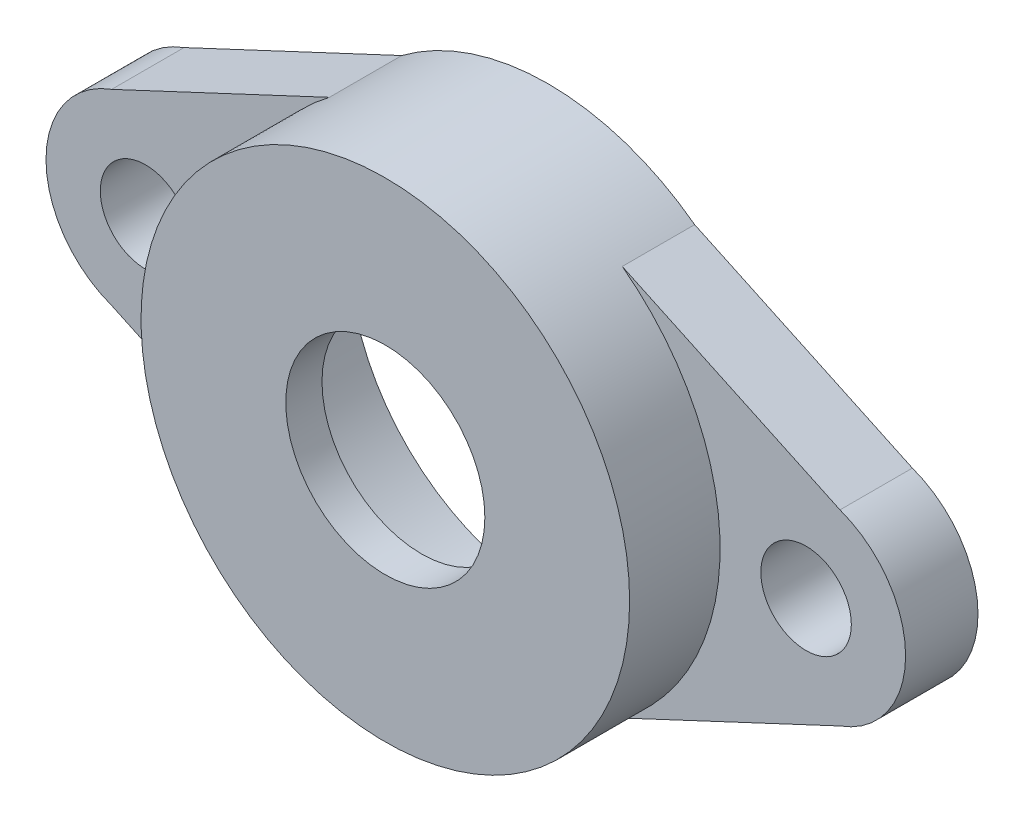
ISO-10303-21;
HEADER;
FILE_DESCRIPTION(('STEP AP214'),'2;1');
FILE_NAME('part.step','',(''),(''),'','','');
FILE_SCHEMA(('AUTOMOTIVE_DESIGN { 1 0 10303 214 1 1 1 1 }'));
ENDSEC;
DATA;
#1=APPLICATION_CONTEXT('core data for automotive mechanical design processes');
#2=APPLICATION_PROTOCOL_DEFINITION('international standard','automotive_design',2000,#1);
#3=PRODUCT_CONTEXT('',#1,'mechanical');
#4=PRODUCT('Part','Part','',(#3));
#5=PRODUCT_RELATED_PRODUCT_CATEGORY('part','',(#4));
#6=PRODUCT_DEFINITION_FORMATION('','',#4);
#7=PRODUCT_DEFINITION_CONTEXT('part definition',#1,'design');
#8=PRODUCT_DEFINITION('design','',#6,#7);
#9=PRODUCT_DEFINITION_SHAPE('','',#8);
#10=(LENGTH_UNIT() NAMED_UNIT(*) SI_UNIT(.MILLI.,.METRE.));
#11=(NAMED_UNIT(*) PLANE_ANGLE_UNIT() SI_UNIT($,.RADIAN.));
#12=(NAMED_UNIT(*) SI_UNIT($,.STERADIAN.) SOLID_ANGLE_UNIT());
#13=UNCERTAINTY_MEASURE_WITH_UNIT(LENGTH_MEASURE(1.E-05),#10,'distance_accuracy_value','');
#14=(GEOMETRIC_REPRESENTATION_CONTEXT(3) GLOBAL_UNCERTAINTY_ASSIGNED_CONTEXT((#13)) GLOBAL_UNIT_ASSIGNED_CONTEXT((#10,
#11,#12)) REPRESENTATION_CONTEXT('',''));
#15=CARTESIAN_POINT('',(0.,0.,0.));
#16=DIRECTION('',(0.,0.,1.));
#17=DIRECTION('',(1.,0.,0.));
#18=AXIS2_PLACEMENT_3D('',#15,#16,#17);
#19=CARTESIAN_POINT('',(0.,0.,4.));
#20=DIRECTION('',(0.,0.,1.));
#21=DIRECTION('',(1.,0.,0.));
#22=AXIS2_PLACEMENT_3D('',#19,#20,#21);
#23=PLANE('',#22);
#24=CARTESIAN_POINT('',(0.,0.,4.));
#25=DIRECTION('',(0.,0.,1.));
#26=DIRECTION('',(1.,0.,0.));
#27=AXIS2_PLACEMENT_3D('',#24,#25,#26);
#28=CIRCLE('',#27,13.5);
#29=CARTESIAN_POINT('',(-8.09371855645499,-10.8047082296976,4.));
#30=VERTEX_POINT('',#29);
#31=CARTESIAN_POINT('',(-8.09371855645499,10.8047082296976,4.));
#32=VERTEX_POINT('',#31);
#33=EDGE_CURVE('E96',#30,#32,#28,.F.);
#34=ORIENTED_EDGE('',*,*,#33,.T.);
#35=DIRECTION('',(-0.905614457047398,-0.424101939616817,0.));
#36=VECTOR('',#35,1.);
#37=CARTESIAN_POINT('',(-20.1239972704098,5.17089298192262,4.));
#38=LINE('',#37,#36);
#39=CARTESIAN_POINT('',(-20.1239972704098,5.17089298192262,4.));
#40=VERTEX_POINT('',#39);
#41=EDGE_CURVE('E148',#32,#40,#38,.T.);
#42=ORIENTED_EDGE('',*,*,#41,.T.);
#43=CARTESIAN_POINT('',(-18.25,0.,4.));
#44=DIRECTION('',(0.,0.,1.));
#45=DIRECTION('',(1.,0.,0.));
#46=AXIS2_PLACEMENT_3D('',#43,#44,#45);
#47=CIRCLE('',#46,5.5);
#48=CARTESIAN_POINT('',(-20.1239972704098,-5.17089298192262,4.));
#49=VERTEX_POINT('',#48);
#50=EDGE_CURVE('E165',#40,#49,#47,.T.);
#51=ORIENTED_EDGE('',*,*,#50,.T.);
#52=DIRECTION('',(0.905614457047398,-0.424101939616817,0.));
#53=VECTOR('',#52,1.);
#54=CARTESIAN_POINT('',(-20.1239972704098,-5.17089298192262,4.));
#55=LINE('',#54,#53);
#56=EDGE_CURVE('E118',#49,#30,#55,.T.);
#57=ORIENTED_EDGE('',*,*,#56,.T.);
#58=EDGE_LOOP('',(#34,#42,#51,#57));
#59=FACE_BOUND('',#58,.T.);
#60=CARTESIAN_POINT('',(-18.25,0.,4.));
#61=DIRECTION('',(0.,0.,1.));
#62=DIRECTION('',(1.,0.,0.));
#63=AXIS2_PLACEMENT_3D('',#60,#61,#62);
#64=CIRCLE('',#63,2.5);
#65=CARTESIAN_POINT('',(-15.75,0.,4.));
#66=VERTEX_POINT('',#65);
#67=EDGE_CURVE('E137',#66,#66,#64,.T.);
#68=ORIENTED_EDGE('',*,*,#67,.F.);
#69=EDGE_LOOP('',(#68));
#70=FACE_BOUND('',#69,.T.);
#71=ADVANCED_FACE('F33',(#59,#70),#23,.T.);
#72=CARTESIAN_POINT('',(8.09371855645499,10.8047082296976,4.));
#73=VERTEX_POINT('',#72);
#74=CARTESIAN_POINT('',(8.09371855645499,-10.8047082296977,4.));
#75=VERTEX_POINT('',#74);
#76=EDGE_CURVE('E114',#73,#75,#28,.F.);
#77=ORIENTED_EDGE('',*,*,#76,.T.);
#78=DIRECTION('',(0.905614457047398,0.424101939616817,0.));
#79=VECTOR('',#78,1.);
#80=CARTESIAN_POINT('',(20.1239972704098,-5.17089298192262,4.));
#81=LINE('',#80,#79);
#82=CARTESIAN_POINT('',(20.1239972704098,-5.17089298192262,4.));
#83=VERTEX_POINT('',#82);
#84=EDGE_CURVE('E107',#75,#83,#81,.T.);
#85=ORIENTED_EDGE('',*,*,#84,.T.);
#86=CARTESIAN_POINT('',(18.25,0.,4.));
#87=DIRECTION('',(0.,0.,1.));
#88=DIRECTION('',(-1.,0.,0.));
#89=AXIS2_PLACEMENT_3D('',#86,#87,#88);
#90=CIRCLE('',#89,5.5);
#91=CARTESIAN_POINT('',(20.1239972704098,5.17089298192262,4.));
#92=VERTEX_POINT('',#91);
#93=EDGE_CURVE('E112',#83,#92,#90,.T.);
#94=ORIENTED_EDGE('',*,*,#93,.T.);
#95=DIRECTION('',(-0.905614457047398,0.424101939616817,0.));
#96=VECTOR('',#95,1.);
#97=CARTESIAN_POINT('',(20.1239972704098,5.17089298192262,4.));
#98=LINE('',#97,#96);
#99=EDGE_CURVE('E51',#92,#73,#98,.T.);
#100=ORIENTED_EDGE('',*,*,#99,.T.);
#101=EDGE_LOOP('',(#77,#85,#94,#100));
#102=FACE_BOUND('',#101,.T.);
#103=CARTESIAN_POINT('',(18.25,0.,4.));
#104=DIRECTION('',(0.,0.,1.));
#105=DIRECTION('',(1.,0.,0.));
#106=AXIS2_PLACEMENT_3D('',#103,#104,#105);
#107=CIRCLE('',#106,2.5);
#108=CARTESIAN_POINT('',(20.75,0.,4.));
#109=VERTEX_POINT('',#108);
#110=EDGE_CURVE('E184',#109,#109,#107,.T.);
#111=ORIENTED_EDGE('',*,*,#110,.F.);
#112=EDGE_LOOP('',(#111));
#113=FACE_BOUND('',#112,.T.);
#114=ADVANCED_FACE('F109',(#102,#113),#23,.T.);
#115=CARTESIAN_POINT('',(0.,0.,0.));
#116=DIRECTION('',(0.,0.,1.));
#117=DIRECTION('',(1.,0.,0.));
#118=AXIS2_PLACEMENT_3D('',#115,#116,#117);
#119=PLANE('',#118);
#120=CARTESIAN_POINT('',(0.,0.,0.));
#121=DIRECTION('',(0.,0.,-1.));
#122=DIRECTION('',(-1.,0.,0.));
#123=AXIS2_PLACEMENT_3D('',#120,#121,#122);
#124=CIRCLE('',#123,11.);
#125=CARTESIAN_POINT('',(-11.,0.,0.));
#126=VERTEX_POINT('',#125);
#127=EDGE_CURVE('E225',#126,#126,#124,.T.);
#128=ORIENTED_EDGE('',*,*,#127,.F.);
#129=EDGE_LOOP('',(#128));
#130=FACE_BOUND('',#129,.T.);
#131=CARTESIAN_POINT('',(0.,0.,0.));
#132=DIRECTION('',(0.,0.,1.));
#133=DIRECTION('',(1.,0.,0.));
#134=AXIS2_PLACEMENT_3D('',#131,#132,#133);
#135=CIRCLE('',#134,13.5);
#136=CARTESIAN_POINT('',(8.09371855645499,10.8047082296976,0.));
#137=VERTEX_POINT('',#136);
#138=CARTESIAN_POINT('',(-8.09371855645499,10.8047082296976,0.));
#139=VERTEX_POINT('',#138);
#140=EDGE_CURVE('E133',#137,#139,#135,.T.);
#141=ORIENTED_EDGE('',*,*,#140,.F.);
#142=DIRECTION('',(-0.905614457047398,0.424101939616817,0.));
#143=VECTOR('',#142,1.);
#144=CARTESIAN_POINT('',(20.1239972704098,5.17089298192262,0.));
#145=LINE('',#144,#143);
#146=CARTESIAN_POINT('',(20.1239972704098,5.17089298192262,0.));
#147=VERTEX_POINT('',#146);
#148=EDGE_CURVE('E87',#147,#137,#145,.T.);
#149=ORIENTED_EDGE('',*,*,#148,.F.);
#150=CARTESIAN_POINT('',(18.25,0.,0.));
#151=DIRECTION('',(0.,0.,1.));
#152=DIRECTION('',(-1.,0.,0.));
#153=AXIS2_PLACEMENT_3D('',#150,#151,#152);
#154=CIRCLE('',#153,5.5);
#155=CARTESIAN_POINT('',(20.1239972704098,-5.17089298192262,0.));
#156=VERTEX_POINT('',#155);
#157=EDGE_CURVE('E81',#156,#147,#154,.T.);
#158=ORIENTED_EDGE('',*,*,#157,.F.);
#159=DIRECTION('',(0.905614457047398,0.424101939616817,0.));
#160=VECTOR('',#159,1.);
#161=CARTESIAN_POINT('',(20.1239972704098,-5.17089298192262,0.));
#162=LINE('',#161,#160);
#163=CARTESIAN_POINT('',(8.093718556455,-10.8047082296976,0.));
#164=VERTEX_POINT('',#163);
#165=EDGE_CURVE('E123',#164,#156,#162,.T.);
#166=ORIENTED_EDGE('',*,*,#165,.F.);
#167=CARTESIAN_POINT('',(0.,0.,0.));
#168=DIRECTION('',(0.,0.,1.));
#169=DIRECTION('',(-1.,0.,0.));
#170=AXIS2_PLACEMENT_3D('',#167,#168,#169);
#171=CIRCLE('',#170,13.5);
#172=CARTESIAN_POINT('',(-8.09371855645499,-10.8047082296976,0.));
#173=VERTEX_POINT('',#172);
#174=EDGE_CURVE('E143',#173,#164,#171,.T.);
#175=ORIENTED_EDGE('',*,*,#174,.F.);
#176=DIRECTION('',(0.905614457047398,-0.424101939616817,0.));
#177=VECTOR('',#176,1.);
#178=CARTESIAN_POINT('',(-20.1239972704098,-5.17089298192262,0.));
#179=LINE('',#178,#177);
#180=CARTESIAN_POINT('',(-20.1239972704098,-5.17089298192262,0.));
#181=VERTEX_POINT('',#180);
#182=EDGE_CURVE('E141',#181,#173,#179,.T.);
#183=ORIENTED_EDGE('',*,*,#182,.F.);
#184=CARTESIAN_POINT('',(-18.25,0.,0.));
#185=DIRECTION('',(0.,0.,1.));
#186=DIRECTION('',(1.,0.,0.));
#187=AXIS2_PLACEMENT_3D('',#184,#185,#186);
#188=CIRCLE('',#187,5.5);
#189=CARTESIAN_POINT('',(-20.1239972704098,5.17089298192262,0.));
#190=VERTEX_POINT('',#189);
#191=EDGE_CURVE('E139',#190,#181,#188,.T.);
#192=ORIENTED_EDGE('',*,*,#191,.F.);
#193=DIRECTION('',(-0.905614457047398,-0.424101939616817,0.));
#194=VECTOR('',#193,1.);
#195=CARTESIAN_POINT('',(-20.1239972704098,5.17089298192262,0.));
#196=LINE('',#195,#194);
#197=EDGE_CURVE('E136',#139,#190,#196,.T.);
#198=ORIENTED_EDGE('',*,*,#197,.F.);
#199=EDGE_LOOP('',(#141,#149,#158,#166,#175,#183,#192,#198));
#200=FACE_BOUND('',#199,.T.);
#201=CARTESIAN_POINT('',(-18.25,0.,0.));
#202=DIRECTION('',(0.,0.,1.));
#203=DIRECTION('',(1.,0.,0.));
#204=AXIS2_PLACEMENT_3D('',#201,#202,#203);
#205=CIRCLE('',#204,2.5);
#206=CARTESIAN_POINT('',(-15.75,0.,0.));
#207=VERTEX_POINT('',#206);
#208=EDGE_CURVE('E191',#207,#207,#205,.T.);
#209=ORIENTED_EDGE('',*,*,#208,.T.);
#210=EDGE_LOOP('',(#209));
#211=FACE_BOUND('',#210,.T.);
#212=CARTESIAN_POINT('',(18.25,0.,0.));
#213=DIRECTION('',(0.,0.,1.));
#214=DIRECTION('',(1.,0.,0.));
#215=AXIS2_PLACEMENT_3D('',#212,#213,#214);
#216=CIRCLE('',#215,2.5);
#217=CARTESIAN_POINT('',(20.75,0.,0.));
#218=VERTEX_POINT('',#217);
#219=EDGE_CURVE('E181',#218,#218,#216,.T.);
#220=ORIENTED_EDGE('',*,*,#219,.T.);
#221=EDGE_LOOP('',(#220));
#222=FACE_BOUND('',#221,.T.);
#223=ADVANCED_FACE('F170',(#130,#200,#211,#222),#119,.F.);
#224=CARTESIAN_POINT('',(-20.1239972704098,5.17089298192262,4.));
#225=DIRECTION('',(0.424101939616817,-0.905614457047398,0.));
#226=DIRECTION('',(0.905614457047398,0.424101939616817,0.));
#227=AXIS2_PLACEMENT_3D('',#224,#225,#226);
#228=PLANE('',#227);
#229=ORIENTED_EDGE('',*,*,#197,.T.);
#230=DIRECTION('',(0.,0.,-1.));
#231=VECTOR('',#230,1.);
#232=CARTESIAN_POINT('',(-20.1239972704098,5.17089298192262,4.));
#233=LINE('',#232,#231);
#234=EDGE_CURVE('E43',#40,#190,#233,.T.);
#235=ORIENTED_EDGE('',*,*,#234,.F.);
#236=ORIENTED_EDGE('',*,*,#41,.F.);
#237=DIRECTION('',(0.,0.,-1.));
#238=VECTOR('',#237,1.);
#239=CARTESIAN_POINT('',(-8.09371855645499,10.8047082296976,4.));
#240=LINE('',#239,#238);
#241=EDGE_CURVE('E11',#32,#139,#240,.T.);
#242=ORIENTED_EDGE('',*,*,#241,.T.);
#243=EDGE_LOOP('',(#229,#235,#236,#242));
#244=FACE_BOUND('',#243,.T.);
#245=ADVANCED_FACE('F35',(#244),#228,.F.);
#246=CARTESIAN_POINT('',(-18.25,0.,4.));
#247=DIRECTION('',(0.,0.,-1.));
#248=DIRECTION('',(-1.,0.,0.));
#249=AXIS2_PLACEMENT_3D('',#246,#247,#248);
#250=CYLINDRICAL_SURFACE('',#249,5.5);
#251=ORIENTED_EDGE('',*,*,#191,.T.);
#252=DIRECTION('',(0.,0.,-1.));
#253=VECTOR('',#252,1.);
#254=CARTESIAN_POINT('',(-20.1239972704098,-5.17089298192262,4.));
#255=LINE('',#254,#253);
#256=EDGE_CURVE('E155',#49,#181,#255,.T.);
#257=ORIENTED_EDGE('',*,*,#256,.F.);
#258=ORIENTED_EDGE('',*,*,#50,.F.);
#259=ORIENTED_EDGE('',*,*,#234,.T.);
#260=EDGE_LOOP('',(#251,#257,#258,#259));
#261=FACE_BOUND('',#260,.T.);
#262=ADVANCED_FACE('F163',(#261),#250,.T.);
#263=CARTESIAN_POINT('',(-20.1239972704098,-5.17089298192262,4.));
#264=DIRECTION('',(0.424101939616817,0.905614457047398,0.));
#265=DIRECTION('',(-0.905614457047398,0.424101939616817,0.));
#266=AXIS2_PLACEMENT_3D('',#263,#264,#265);
#267=PLANE('',#266);
#268=ORIENTED_EDGE('',*,*,#182,.T.);
#269=DIRECTION('',(0.,0.,-1.));
#270=VECTOR('',#269,1.);
#271=CARTESIAN_POINT('',(-8.09371855645499,-10.8047082296976,4.));
#272=LINE('',#271,#270);
#273=EDGE_CURVE('E152',#30,#173,#272,.T.);
#274=ORIENTED_EDGE('',*,*,#273,.F.);
#275=ORIENTED_EDGE('',*,*,#56,.F.);
#276=ORIENTED_EDGE('',*,*,#256,.T.);
#277=EDGE_LOOP('',(#268,#274,#275,#276));
#278=FACE_BOUND('',#277,.T.);
#279=ADVANCED_FACE('F175',(#278),#267,.F.);
#280=CARTESIAN_POINT('',(0.,0.,4.));
#281=DIRECTION('',(0.,0.,-1.));
#282=DIRECTION('',(-1.,0.,0.));
#283=AXIS2_PLACEMENT_3D('',#280,#281,#282);
#284=CYLINDRICAL_SURFACE('',#283,13.5);
#285=ORIENTED_EDGE('',*,*,#174,.T.);
#286=DIRECTION('',(0.,0.,-1.));
#287=VECTOR('',#286,1.);
#288=CARTESIAN_POINT('',(8.093718556455,-10.8047082296976,4.));
#289=LINE('',#288,#287);
#290=EDGE_CURVE('E124',#75,#164,#289,.T.);
#291=ORIENTED_EDGE('',*,*,#290,.F.);
#292=ORIENTED_EDGE('',*,*,#76,.F.);
#293=DIRECTION('',(0.,0.,-1.));
#294=VECTOR('',#293,1.);
#295=CARTESIAN_POINT('',(8.09371855645499,10.8047082296976,4.));
#296=LINE('',#295,#294);
#297=EDGE_CURVE('E129',#73,#137,#296,.T.);
#298=ORIENTED_EDGE('',*,*,#297,.T.);
#299=ORIENTED_EDGE('',*,*,#140,.T.);
#300=ORIENTED_EDGE('',*,*,#241,.F.);
#301=ORIENTED_EDGE('',*,*,#33,.F.);
#302=ORIENTED_EDGE('',*,*,#273,.T.);
#303=EDGE_LOOP('',(#285,#291,#292,#298,#299,#300,#301,#302));
#304=FACE_BOUND('',#303,.T.);
#305=CARTESIAN_POINT('',(0.,0.,9.));
#306=DIRECTION('',(0.,0.,1.));
#307=DIRECTION('',(1.,0.,0.));
#308=AXIS2_PLACEMENT_3D('',#305,#306,#307);
#309=CIRCLE('',#308,13.5);
#310=CARTESIAN_POINT('',(13.5,0.,9.));
#311=VERTEX_POINT('',#310);
#312=EDGE_CURVE('E186',#311,#311,#309,.T.);
#313=ORIENTED_EDGE('',*,*,#312,.F.);
#314=EDGE_LOOP('',(#313));
#315=FACE_BOUND('',#314,.T.);
#316=ADVANCED_FACE('F178',(#304,#315),#284,.T.);
#317=CARTESIAN_POINT('',(20.1239972704098,-5.17089298192262,4.));
#318=DIRECTION('',(-0.424101939616817,0.905614457047398,0.));
#319=DIRECTION('',(-0.905614457047398,-0.424101939616817,0.));
#320=AXIS2_PLACEMENT_3D('',#317,#318,#319);
#321=PLANE('',#320);
#322=ORIENTED_EDGE('',*,*,#165,.T.);
#323=DIRECTION('',(0.,0.,-1.));
#324=VECTOR('',#323,1.);
#325=CARTESIAN_POINT('',(20.1239972704098,-5.17089298192262,4.));
#326=LINE('',#325,#324);
#327=EDGE_CURVE('E120',#83,#156,#326,.T.);
#328=ORIENTED_EDGE('',*,*,#327,.F.);
#329=ORIENTED_EDGE('',*,*,#84,.F.);
#330=ORIENTED_EDGE('',*,*,#290,.T.);
#331=EDGE_LOOP('',(#322,#328,#329,#330));
#332=FACE_BOUND('',#331,.T.);
#333=ADVANCED_FACE('F121',(#332),#321,.F.);
#334=CARTESIAN_POINT('',(18.25,0.,4.));
#335=DIRECTION('',(0.,0.,-1.));
#336=DIRECTION('',(-1.,0.,0.));
#337=AXIS2_PLACEMENT_3D('',#334,#335,#336);
#338=CYLINDRICAL_SURFACE('',#337,5.5);
#339=ORIENTED_EDGE('',*,*,#157,.T.);
#340=DIRECTION('',(0.,0.,-1.));
#341=VECTOR('',#340,1.);
#342=CARTESIAN_POINT('',(20.1239972704098,5.17089298192262,4.));
#343=LINE('',#342,#341);
#344=EDGE_CURVE('E125',#92,#147,#343,.T.);
#345=ORIENTED_EDGE('',*,*,#344,.F.);
#346=ORIENTED_EDGE('',*,*,#93,.F.);
#347=ORIENTED_EDGE('',*,*,#327,.T.);
#348=EDGE_LOOP('',(#339,#345,#346,#347));
#349=FACE_BOUND('',#348,.T.);
#350=ADVANCED_FACE('F127',(#349),#338,.T.);
#351=CARTESIAN_POINT('',(20.1239972704098,5.17089298192262,4.));
#352=DIRECTION('',(-0.424101939616817,-0.905614457047398,0.));
#353=DIRECTION('',(0.905614457047398,-0.424101939616817,0.));
#354=AXIS2_PLACEMENT_3D('',#351,#352,#353);
#355=PLANE('',#354);
#356=ORIENTED_EDGE('',*,*,#148,.T.);
#357=ORIENTED_EDGE('',*,*,#297,.F.);
#358=ORIENTED_EDGE('',*,*,#99,.F.);
#359=ORIENTED_EDGE('',*,*,#344,.T.);
#360=EDGE_LOOP('',(#356,#357,#358,#359));
#361=FACE_BOUND('',#360,.T.);
#362=ADVANCED_FACE('F199',(#361),#355,.F.);
#363=CARTESIAN_POINT('',(-18.25,0.,4.));
#364=DIRECTION('',(0.,0.,-1.));
#365=DIRECTION('',(-1.,0.,0.));
#366=AXIS2_PLACEMENT_3D('',#363,#364,#365);
#367=CYLINDRICAL_SURFACE('',#366,2.5);
#368=ORIENTED_EDGE('',*,*,#67,.T.);
#369=EDGE_LOOP('',(#368));
#370=FACE_BOUND('',#369,.T.);
#371=ORIENTED_EDGE('',*,*,#208,.F.);
#372=EDGE_LOOP('',(#371));
#373=FACE_BOUND('',#372,.T.);
#374=ADVANCED_FACE('F201',(#370,#373),#367,.F.);
#375=CARTESIAN_POINT('',(18.25,0.,4.));
#376=DIRECTION('',(0.,0.,-1.));
#377=DIRECTION('',(-1.,0.,0.));
#378=AXIS2_PLACEMENT_3D('',#375,#376,#377);
#379=CYLINDRICAL_SURFACE('',#378,2.5);
#380=ORIENTED_EDGE('',*,*,#110,.T.);
#381=EDGE_LOOP('',(#380));
#382=FACE_BOUND('',#381,.T.);
#383=ORIENTED_EDGE('',*,*,#219,.F.);
#384=EDGE_LOOP('',(#383));
#385=FACE_BOUND('',#384,.T.);
#386=ADVANCED_FACE('F207',(#382,#385),#379,.F.);
#387=CARTESIAN_POINT('',(0.,0.,9.));
#388=DIRECTION('',(0.,0.,1.));
#389=DIRECTION('',(1.,0.,0.));
#390=AXIS2_PLACEMENT_3D('',#387,#388,#389);
#391=PLANE('',#390);
#392=CARTESIAN_POINT('',(0.,0.,9.));
#393=DIRECTION('',(0.,0.,1.));
#394=DIRECTION('',(1.,0.,0.));
#395=AXIS2_PLACEMENT_3D('',#392,#393,#394);
#396=CIRCLE('',#395,5.5);
#397=CARTESIAN_POINT('',(5.5,0.,9.));
#398=VERTEX_POINT('',#397);
#399=EDGE_CURVE('E228',#398,#398,#396,.T.);
#400=ORIENTED_EDGE('',*,*,#399,.F.);
#401=EDGE_LOOP('',(#400));
#402=FACE_BOUND('',#401,.T.);
#403=ORIENTED_EDGE('',*,*,#312,.T.);
#404=EDGE_LOOP('',(#403));
#405=FACE_BOUND('',#404,.T.);
#406=ADVANCED_FACE('F248',(#402,#405),#391,.T.);
#407=CARTESIAN_POINT('',(0.,0.,7.));
#408=DIRECTION('',(0.,0.,-1.));
#409=DIRECTION('',(-1.,0.,0.));
#410=AXIS2_PLACEMENT_3D('',#407,#408,#409);
#411=CYLINDRICAL_SURFACE('',#410,11.);
#412=CARTESIAN_POINT('',(0.,0.,7.));
#413=DIRECTION('',(0.,0.,-1.));
#414=DIRECTION('',(-1.,0.,0.));
#415=AXIS2_PLACEMENT_3D('',#412,#413,#414);
#416=CIRCLE('',#415,11.);
#417=CARTESIAN_POINT('',(-11.,0.,7.));
#418=VERTEX_POINT('',#417);
#419=EDGE_CURVE('E227',#418,#418,#416,.T.);
#420=ORIENTED_EDGE('',*,*,#419,.F.);
#421=EDGE_LOOP('',(#420));
#422=FACE_BOUND('',#421,.T.);
#423=ORIENTED_EDGE('',*,*,#127,.T.);
#424=EDGE_LOOP('',(#423));
#425=FACE_BOUND('',#424,.T.);
#426=ADVANCED_FACE('F243',(#422,#425),#411,.F.);
#427=CARTESIAN_POINT('',(0.,0.,7.));
#428=DIRECTION('',(0.,0.,-1.));
#429=DIRECTION('',(-1.,0.,0.));
#430=AXIS2_PLACEMENT_3D('',#427,#428,#429);
#431=PLANE('',#430);
#432=CARTESIAN_POINT('',(0.,0.,7.));
#433=DIRECTION('',(0.,0.,-1.));
#434=DIRECTION('',(-1.,0.,0.));
#435=AXIS2_PLACEMENT_3D('',#432,#433,#434);
#436=CIRCLE('',#435,5.5);
#437=CARTESIAN_POINT('',(-5.5,0.,7.));
#438=VERTEX_POINT('',#437);
#439=EDGE_CURVE('E37',#438,#438,#436,.T.);
#440=ORIENTED_EDGE('',*,*,#439,.F.);
#441=EDGE_LOOP('',(#440));
#442=FACE_BOUND('',#441,.T.);
#443=ORIENTED_EDGE('',*,*,#419,.T.);
#444=EDGE_LOOP('',(#443));
#445=FACE_BOUND('',#444,.T.);
#446=ADVANCED_FACE('F240',(#442,#445),#431,.T.);
#447=CARTESIAN_POINT('',(0.,0.,6.));
#448=DIRECTION('',(0.,0.,1.));
#449=DIRECTION('',(1.,0.,0.));
#450=AXIS2_PLACEMENT_3D('',#447,#448,#449);
#451=CYLINDRICAL_SURFACE('',#450,5.5);
#452=ORIENTED_EDGE('',*,*,#399,.T.);
#453=EDGE_LOOP('',(#452));
#454=FACE_BOUND('',#453,.T.);
#455=ORIENTED_EDGE('',*,*,#439,.T.);
#456=EDGE_LOOP('',(#455));
#457=FACE_BOUND('',#456,.T.);
#458=ADVANCED_FACE('F238',(#454,#457),#451,.F.);
#459=CLOSED_SHELL('',(#71,#114,#223,#245,#262,#279,#316,#333,#350,#362,#374,#386,#406,#426,#446,#458));
#460=MANIFOLD_SOLID_BREP('B2',#459);
#461=ADVANCED_BREP_SHAPE_REPRESENTATION('',(#18,#460),#14);
#462=SHAPE_DEFINITION_REPRESENTATION(#9,#461);
ENDSEC;
END-ISO-10303-21;
